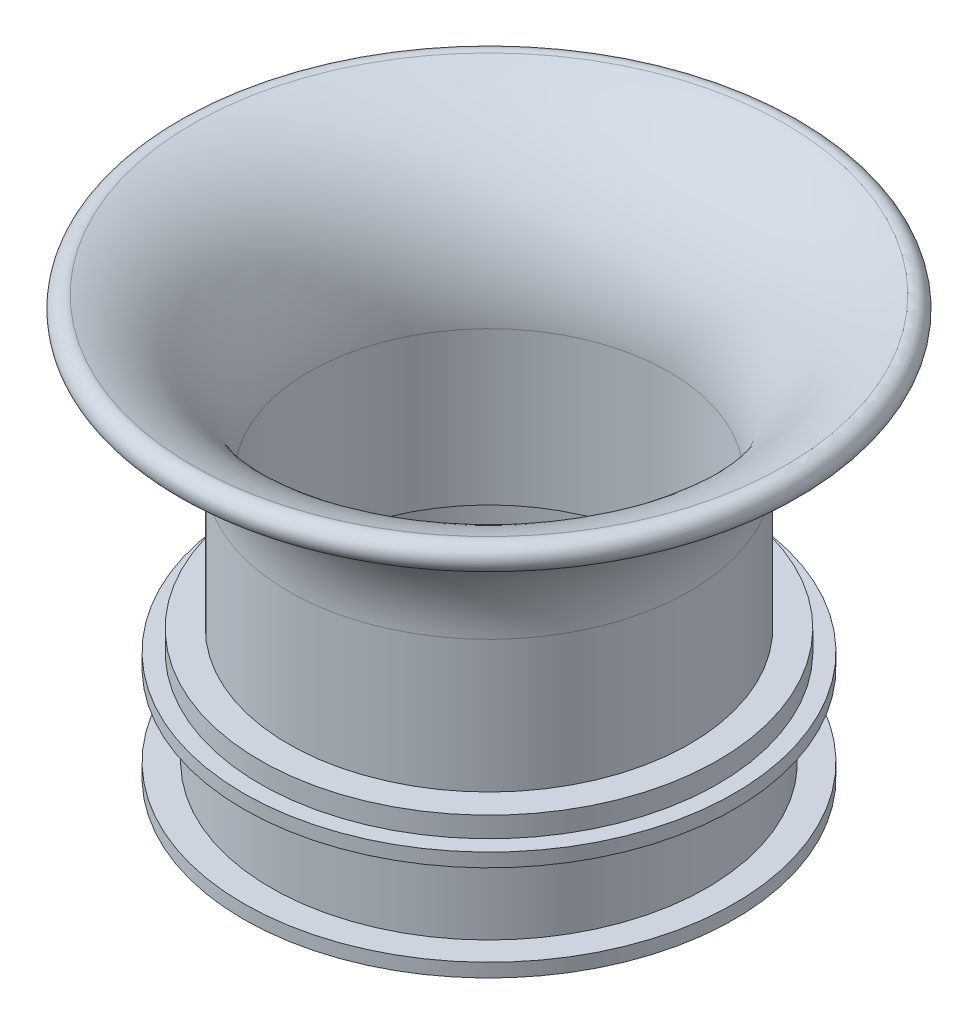
ISO-10303-21;
HEADER;
FILE_DESCRIPTION(('STEP AP214'),'2;1');
FILE_NAME('part.step','',(''),(''),'','','');
FILE_SCHEMA(('AUTOMOTIVE_DESIGN { 1 0 10303 214 1 1 1 1 }'));
ENDSEC;
DATA;
#1=APPLICATION_CONTEXT('core data for automotive mechanical design processes');
#2=APPLICATION_PROTOCOL_DEFINITION('international standard','automotive_design',2000,#1);
#3=PRODUCT_CONTEXT('',#1,'mechanical');
#4=PRODUCT('Part','Part','',(#3));
#5=PRODUCT_RELATED_PRODUCT_CATEGORY('part','',(#4));
#6=PRODUCT_DEFINITION_FORMATION('','',#4);
#7=PRODUCT_DEFINITION_CONTEXT('part definition',#1,'design');
#8=PRODUCT_DEFINITION('design','',#6,#7);
#9=PRODUCT_DEFINITION_SHAPE('','',#8);
#10=(LENGTH_UNIT() NAMED_UNIT(*) SI_UNIT(.MILLI.,.METRE.));
#11=(NAMED_UNIT(*) PLANE_ANGLE_UNIT() SI_UNIT($,.RADIAN.));
#12=(NAMED_UNIT(*) SI_UNIT($,.STERADIAN.) SOLID_ANGLE_UNIT());
#13=UNCERTAINTY_MEASURE_WITH_UNIT(LENGTH_MEASURE(1.E-05),#10,'distance_accuracy_value','');
#14=(GEOMETRIC_REPRESENTATION_CONTEXT(3) GLOBAL_UNCERTAINTY_ASSIGNED_CONTEXT((#13)) GLOBAL_UNIT_ASSIGNED_CONTEXT((#10,
#11,#12)) REPRESENTATION_CONTEXT('',''));
#15=CARTESIAN_POINT('',(0.,0.,0.));
#16=DIRECTION('',(0.,0.,1.));
#17=DIRECTION('',(1.,0.,0.));
#18=AXIS2_PLACEMENT_3D('',#15,#16,#17);
#19=CARTESIAN_POINT('',(0.,0.,0.));
#20=DIRECTION('',(0.,-1.,0.));
#21=DIRECTION('',(0.,0.,-1.));
#22=AXIS2_PLACEMENT_3D('',#19,#20,#21);
#23=CYLINDRICAL_SURFACE('',#22,22.225);
#24=CARTESIAN_POINT('',(0.,0.,0.));
#25=DIRECTION('',(0.,-1.,0.));
#26=DIRECTION('',(0.,0.,-1.));
#27=AXIS2_PLACEMENT_3D('',#24,#25,#26);
#28=CIRCLE('',#27,22.225);
#29=CARTESIAN_POINT('',(0.,0.,-22.225));
#30=VERTEX_POINT('',#29);
#31=EDGE_CURVE('E88',#30,#30,#28,.T.);
#32=ORIENTED_EDGE('',*,*,#31,.T.);
#33=EDGE_LOOP('',(#32));
#34=FACE_BOUND('',#33,.T.);
#35=CARTESIAN_POINT('',(0.,12.7,0.));
#36=DIRECTION('',(0.,-1.,0.));
#37=DIRECTION('',(0.,0.,-1.));
#38=AXIS2_PLACEMENT_3D('',#35,#36,#37);
#39=CIRCLE('',#38,22.225);
#40=CARTESIAN_POINT('',(0.,12.7,-22.225));
#41=VERTEX_POINT('',#40);
#42=EDGE_CURVE('E10',#41,#41,#39,.T.);
#43=ORIENTED_EDGE('',*,*,#42,.F.);
#44=EDGE_LOOP('',(#43));
#45=FACE_BOUND('',#44,.T.);
#46=ADVANCED_FACE('F36',(#34,#45),#23,.F.);
#47=CARTESIAN_POINT('',(20.955,12.7,0.));
#48=DIRECTION('',(0.,-1.,0.));
#49=DIRECTION('',(0.,0.,-1.));
#50=AXIS2_PLACEMENT_3D('',#47,#48,#49);
#51=PLANE('',#50);
#52=ORIENTED_EDGE('',*,*,#42,.T.);
#53=EDGE_LOOP('',(#52));
#54=FACE_BOUND('',#53,.T.);
#55=CARTESIAN_POINT('',(0.,12.7,0.));
#56=DIRECTION('',(0.,-1.,0.));
#57=DIRECTION('',(0.,0.,-1.));
#58=AXIS2_PLACEMENT_3D('',#55,#56,#57);
#59=CIRCLE('',#58,20.955);
#60=CARTESIAN_POINT('',(0.,12.7,-20.955));
#61=VERTEX_POINT('',#60);
#62=EDGE_CURVE('E42',#61,#61,#59,.T.);
#63=ORIENTED_EDGE('',*,*,#62,.F.);
#64=EDGE_LOOP('',(#63));
#65=FACE_BOUND('',#64,.T.);
#66=ADVANCED_FACE('F106',(#54,#65),#51,.T.);
#67=CARTESIAN_POINT('',(0.,0.,0.));
#68=DIRECTION('',(0.,-1.,0.));
#69=DIRECTION('',(0.,0.,-1.));
#70=AXIS2_PLACEMENT_3D('',#67,#68,#69);
#71=CYLINDRICAL_SURFACE('',#70,20.955);
#72=ORIENTED_EDGE('',*,*,#62,.T.);
#73=EDGE_LOOP('',(#72));
#74=FACE_BOUND('',#73,.T.);
#75=CARTESIAN_POINT('',(0.,30.48,0.));
#76=DIRECTION('',(0.,-1.,0.));
#77=DIRECTION('',(0.,0.,-1.));
#78=AXIS2_PLACEMENT_3D('',#75,#76,#77);
#79=CIRCLE('',#78,20.955);
#80=CARTESIAN_POINT('',(0.,30.48,-20.955));
#81=VERTEX_POINT('',#80);
#82=EDGE_CURVE('E46',#81,#81,#79,.T.);
#83=ORIENTED_EDGE('',*,*,#82,.F.);
#84=EDGE_LOOP('',(#83));
#85=FACE_BOUND('',#84,.T.);
#86=ADVANCED_FACE('F110',(#74,#85),#71,.F.);
#87=CARTESIAN_POINT('',(0.,30.48,0.));
#88=DIRECTION('',(0.,-1.,0.));
#89=DIRECTION('',(0.,0.,-1.));
#90=AXIS2_PLACEMENT_3D('',#87,#88,#89);
#91=TOROIDAL_SURFACE('',#90,40.005,19.05);
#92=ORIENTED_EDGE('',*,*,#82,.T.);
#93=EDGE_LOOP('',(#92));
#94=FACE_BOUND('',#93,.T.);
#95=CARTESIAN_POINT('',(0.,48.7159047481845,0.));
#96=DIRECTION('',(0.,-1.,0.));
#97=DIRECTION('',(0.,0.,-1.));
#98=AXIS2_PLACEMENT_3D('',#95,#96,#97);
#99=CIRCLE('',#98,34.4955283361159);
#100=CARTESIAN_POINT('',(0.,48.7159047481845,-34.4955283361159));
#101=VERTEX_POINT('',#100);
#102=EDGE_CURVE('E50',#101,#101,#99,.T.);
#103=ORIENTED_EDGE('',*,*,#102,.F.);
#104=EDGE_LOOP('',(#103));
#105=FACE_BOUND('',#104,.T.);
#106=ADVANCED_FACE('F114',(#94,#105),#91,.T.);
#107=CARTESIAN_POINT('',(0.,47.2943883429048,0.));
#108=DIRECTION('',(0.,-1.,0.));
#109=DIRECTION('',(0.,0.,-1.));
#110=AXIS2_PLACEMENT_3D('',#107,#108,#109);
#111=TOROIDAL_SURFACE('',#110,34.925,1.48497636363637);
#112=ORIENTED_EDGE('',*,*,#102,.T.);
#113=EDGE_LOOP('',(#112));
#114=FACE_BOUND('',#113,.T.);
#115=CARTESIAN_POINT('',(0.,45.8560817038175,0.));
#116=DIRECTION('',(0.,-1.,0.));
#117=DIRECTION('',(0.,0.,-1.));
#118=AXIS2_PLACEMENT_3D('',#115,#116,#117);
#119=CIRCLE('',#118,35.2943627113233);
#120=CARTESIAN_POINT('',(0.,45.8560817038175,-35.2943627113233));
#121=VERTEX_POINT('',#120);
#122=EDGE_CURVE('E55',#121,#121,#119,.T.);
#123=ORIENTED_EDGE('',*,*,#122,.F.);
#124=EDGE_LOOP('',(#123));
#125=FACE_BOUND('',#124,.T.);
#126=ADVANCED_FACE('F120',(#114,#125),#111,.T.);
#127=CARTESIAN_POINT('',(0.,30.48,0.));
#128=DIRECTION('',(0.,-1.,0.));
#129=DIRECTION('',(0.,0.,-1.));
#130=AXIS2_PLACEMENT_3D('',#127,#128,#129);
#131=TOROIDAL_SURFACE('',#130,39.243,15.875);
#132=ORIENTED_EDGE('',*,*,#122,.T.);
#133=EDGE_LOOP('',(#132));
#134=FACE_BOUND('',#133,.T.);
#135=CARTESIAN_POINT('',(0.,30.48,0.));
#136=DIRECTION('',(0.,-1.,0.));
#137=DIRECTION('',(0.,0.,-1.));
#138=AXIS2_PLACEMENT_3D('',#135,#136,#137);
#139=CIRCLE('',#138,23.368);
#140=CARTESIAN_POINT('',(0.,30.48,-23.368));
#141=VERTEX_POINT('',#140);
#142=EDGE_CURVE('E58',#141,#141,#139,.T.);
#143=ORIENTED_EDGE('',*,*,#142,.F.);
#144=EDGE_LOOP('',(#143));
#145=FACE_BOUND('',#144,.T.);
#146=ADVANCED_FACE('F124',(#134,#145),#131,.F.);
#147=CARTESIAN_POINT('',(0.,0.,0.));
#148=DIRECTION('',(0.,-1.,0.));
#149=DIRECTION('',(0.,0.,-1.));
#150=AXIS2_PLACEMENT_3D('',#147,#148,#149);
#151=CYLINDRICAL_SURFACE('',#150,23.368);
#152=ORIENTED_EDGE('',*,*,#142,.T.);
#153=EDGE_LOOP('',(#152));
#154=FACE_BOUND('',#153,.T.);
#155=CARTESIAN_POINT('',(0.,15.0792297306339,0.));
#156=DIRECTION('',(0.,-1.,0.));
#157=DIRECTION('',(0.,0.,-1.));
#158=AXIS2_PLACEMENT_3D('',#155,#156,#157);
#159=CIRCLE('',#158,23.368);
#160=CARTESIAN_POINT('',(0.,15.0792297306339,-23.368));
#161=VERTEX_POINT('',#160);
#162=EDGE_CURVE('E61',#161,#161,#159,.T.);
#163=ORIENTED_EDGE('',*,*,#162,.F.);
#164=EDGE_LOOP('',(#163));
#165=FACE_BOUND('',#164,.T.);
#166=ADVANCED_FACE('F128',(#154,#165),#151,.T.);
#167=CARTESIAN_POINT('',(23.368,15.0792297306339,0.));
#168=DIRECTION('',(0.,1.,0.));
#169=DIRECTION('',(0.,0.,1.));
#170=AXIS2_PLACEMENT_3D('',#167,#168,#169);
#171=PLANE('',#170);
#172=ORIENTED_EDGE('',*,*,#162,.T.);
#173=EDGE_LOOP('',(#172));
#174=FACE_BOUND('',#173,.T.);
#175=CARTESIAN_POINT('',(0.,15.0792297306339,0.));
#176=DIRECTION('',(0.,-1.,0.));
#177=DIRECTION('',(0.,0.,-1.));
#178=AXIS2_PLACEMENT_3D('',#175,#176,#177);
#179=CIRCLE('',#178,26.67);
#180=CARTESIAN_POINT('',(0.,15.0792297306339,-26.67));
#181=VERTEX_POINT('',#180);
#182=EDGE_CURVE('E64',#181,#181,#179,.T.);
#183=ORIENTED_EDGE('',*,*,#182,.F.);
#184=EDGE_LOOP('',(#183));
#185=FACE_BOUND('',#184,.T.);
#186=ADVANCED_FACE('F132',(#174,#185),#171,.T.);
#187=CARTESIAN_POINT('',(0.,0.,0.));
#188=DIRECTION('',(0.,-1.,0.));
#189=DIRECTION('',(0.,0.,-1.));
#190=AXIS2_PLACEMENT_3D('',#187,#188,#189);
#191=CYLINDRICAL_SURFACE('',#190,26.67);
#192=ORIENTED_EDGE('',*,*,#182,.T.);
#193=EDGE_LOOP('',(#192));
#194=FACE_BOUND('',#193,.T.);
#195=CARTESIAN_POINT('',(0.,12.7,0.));
#196=DIRECTION('',(0.,-1.,0.));
#197=DIRECTION('',(0.,0.,-1.));
#198=AXIS2_PLACEMENT_3D('',#195,#196,#197);
#199=CIRCLE('',#198,26.67);
#200=CARTESIAN_POINT('',(0.,12.7,-26.67));
#201=VERTEX_POINT('',#200);
#202=EDGE_CURVE('E67',#201,#201,#199,.T.);
#203=ORIENTED_EDGE('',*,*,#202,.F.);
#204=EDGE_LOOP('',(#203));
#205=FACE_BOUND('',#204,.T.);
#206=ADVANCED_FACE('F136',(#194,#205),#191,.T.);
#207=CARTESIAN_POINT('',(26.67,12.7,0.));
#208=DIRECTION('',(0.,1.,0.));
#209=DIRECTION('',(0.,0.,1.));
#210=AXIS2_PLACEMENT_3D('',#207,#208,#209);
#211=PLANE('',#210);
#212=ORIENTED_EDGE('',*,*,#202,.T.);
#213=EDGE_LOOP('',(#212));
#214=FACE_BOUND('',#213,.T.);
#215=CARTESIAN_POINT('',(0.,12.7,0.));
#216=DIRECTION('',(0.,-1.,0.));
#217=DIRECTION('',(0.,0.,-1.));
#218=AXIS2_PLACEMENT_3D('',#215,#216,#217);
#219=CIRCLE('',#218,28.575);
#220=CARTESIAN_POINT('',(0.,12.7,-28.575));
#221=VERTEX_POINT('',#220);
#222=EDGE_CURVE('E70',#221,#221,#219,.T.);
#223=ORIENTED_EDGE('',*,*,#222,.F.);
#224=EDGE_LOOP('',(#223));
#225=FACE_BOUND('',#224,.T.);
#226=ADVANCED_FACE('F140',(#214,#225),#211,.T.);
#227=CARTESIAN_POINT('',(0.,0.,0.));
#228=DIRECTION('',(0.,-1.,0.));
#229=DIRECTION('',(0.,0.,-1.));
#230=AXIS2_PLACEMENT_3D('',#227,#228,#229);
#231=CYLINDRICAL_SURFACE('',#230,28.575);
#232=ORIENTED_EDGE('',*,*,#222,.T.);
#233=EDGE_LOOP('',(#232));
#234=FACE_BOUND('',#233,.T.);
#235=CARTESIAN_POINT('',(0.,11.1125,0.));
#236=DIRECTION('',(0.,-1.,0.));
#237=DIRECTION('',(0.,0.,-1.));
#238=AXIS2_PLACEMENT_3D('',#235,#236,#237);
#239=CIRCLE('',#238,28.575);
#240=CARTESIAN_POINT('',(0.,11.1125,-28.575));
#241=VERTEX_POINT('',#240);
#242=EDGE_CURVE('E73',#241,#241,#239,.T.);
#243=ORIENTED_EDGE('',*,*,#242,.F.);
#244=EDGE_LOOP('',(#243));
#245=FACE_BOUND('',#244,.T.);
#246=ADVANCED_FACE('F144',(#234,#245),#231,.T.);
#247=CARTESIAN_POINT('',(28.575,11.1125,0.));
#248=DIRECTION('',(0.,-1.,0.));
#249=DIRECTION('',(0.,0.,-1.));
#250=AXIS2_PLACEMENT_3D('',#247,#248,#249);
#251=PLANE('',#250);
#252=ORIENTED_EDGE('',*,*,#242,.T.);
#253=EDGE_LOOP('',(#252));
#254=FACE_BOUND('',#253,.T.);
#255=CARTESIAN_POINT('',(0.,11.1125,0.));
#256=DIRECTION('',(0.,-1.,0.));
#257=DIRECTION('',(0.,0.,-1.));
#258=AXIS2_PLACEMENT_3D('',#255,#256,#257);
#259=CIRCLE('',#258,25.4);
#260=CARTESIAN_POINT('',(0.,11.1125,-25.4));
#261=VERTEX_POINT('',#260);
#262=EDGE_CURVE('E76',#261,#261,#259,.T.);
#263=ORIENTED_EDGE('',*,*,#262,.F.);
#264=EDGE_LOOP('',(#263));
#265=FACE_BOUND('',#264,.T.);
#266=ADVANCED_FACE('F148',(#254,#265),#251,.T.);
#267=CARTESIAN_POINT('',(0.,0.,0.));
#268=DIRECTION('',(0.,-1.,0.));
#269=DIRECTION('',(0.,0.,-1.));
#270=AXIS2_PLACEMENT_3D('',#267,#268,#269);
#271=CYLINDRICAL_SURFACE('',#270,25.4);
#272=ORIENTED_EDGE('',*,*,#262,.T.);
#273=EDGE_LOOP('',(#272));
#274=FACE_BOUND('',#273,.T.);
#275=CARTESIAN_POINT('',(0.,1.5875,0.));
#276=DIRECTION('',(0.,-1.,0.));
#277=DIRECTION('',(0.,0.,-1.));
#278=AXIS2_PLACEMENT_3D('',#275,#276,#277);
#279=CIRCLE('',#278,25.4);
#280=CARTESIAN_POINT('',(0.,1.5875,-25.4));
#281=VERTEX_POINT('',#280);
#282=EDGE_CURVE('E79',#281,#281,#279,.T.);
#283=ORIENTED_EDGE('',*,*,#282,.F.);
#284=EDGE_LOOP('',(#283));
#285=FACE_BOUND('',#284,.T.);
#286=ADVANCED_FACE('F152',(#274,#285),#271,.T.);
#287=CARTESIAN_POINT('',(25.4,1.5875,0.));
#288=DIRECTION('',(0.,1.,0.));
#289=DIRECTION('',(0.,0.,1.));
#290=AXIS2_PLACEMENT_3D('',#287,#288,#289);
#291=PLANE('',#290);
#292=ORIENTED_EDGE('',*,*,#282,.T.);
#293=EDGE_LOOP('',(#292));
#294=FACE_BOUND('',#293,.T.);
#295=CARTESIAN_POINT('',(0.,1.5875,0.));
#296=DIRECTION('',(0.,-1.,0.));
#297=DIRECTION('',(0.,0.,-1.));
#298=AXIS2_PLACEMENT_3D('',#295,#296,#297);
#299=CIRCLE('',#298,28.575);
#300=CARTESIAN_POINT('',(0.,1.5875,-28.575));
#301=VERTEX_POINT('',#300);
#302=EDGE_CURVE('E82',#301,#301,#299,.T.);
#303=ORIENTED_EDGE('',*,*,#302,.F.);
#304=EDGE_LOOP('',(#303));
#305=FACE_BOUND('',#304,.T.);
#306=ADVANCED_FACE('F102',(#294,#305),#291,.T.);
#307=CARTESIAN_POINT('',(0.,0.,0.));
#308=DIRECTION('',(0.,-1.,0.));
#309=DIRECTION('',(0.,0.,-1.));
#310=AXIS2_PLACEMENT_3D('',#307,#308,#309);
#311=CYLINDRICAL_SURFACE('',#310,28.575);
#312=ORIENTED_EDGE('',*,*,#302,.T.);
#313=EDGE_LOOP('',(#312));
#314=FACE_BOUND('',#313,.T.);
#315=CARTESIAN_POINT('',(0.,0.,0.));
#316=DIRECTION('',(0.,-1.,0.));
#317=DIRECTION('',(0.,0.,-1.));
#318=AXIS2_PLACEMENT_3D('',#315,#316,#317);
#319=CIRCLE('',#318,28.575);
#320=CARTESIAN_POINT('',(0.,0.,-28.575));
#321=VERTEX_POINT('',#320);
#322=EDGE_CURVE('E85',#321,#321,#319,.T.);
#323=ORIENTED_EDGE('',*,*,#322,.F.);
#324=EDGE_LOOP('',(#323));
#325=FACE_BOUND('',#324,.T.);
#326=ADVANCED_FACE('F96',(#314,#325),#311,.T.);
#327=CARTESIAN_POINT('',(28.575,0.,0.));
#328=DIRECTION('',(0.,-1.,0.));
#329=DIRECTION('',(0.,0.,-1.));
#330=AXIS2_PLACEMENT_3D('',#327,#328,#329);
#331=PLANE('',#330);
#332=ORIENTED_EDGE('',*,*,#322,.T.);
#333=EDGE_LOOP('',(#332));
#334=FACE_BOUND('',#333,.T.);
#335=ORIENTED_EDGE('',*,*,#31,.F.);
#336=EDGE_LOOP('',(#335));
#337=FACE_BOUND('',#336,.T.);
#338=ADVANCED_FACE('F94',(#334,#337),#331,.T.);
#339=CLOSED_SHELL('',(#46,#66,#86,#106,#126,#146,#166,#186,#206,#226,#246,#266,#286,#306,#326,#338));
#340=MANIFOLD_SOLID_BREP('B2',#339);
#341=ADVANCED_BREP_SHAPE_REPRESENTATION('',(#18,#340),#14);
#342=SHAPE_DEFINITION_REPRESENTATION(#9,#341);
ENDSEC;
END-ISO-10303-21;
